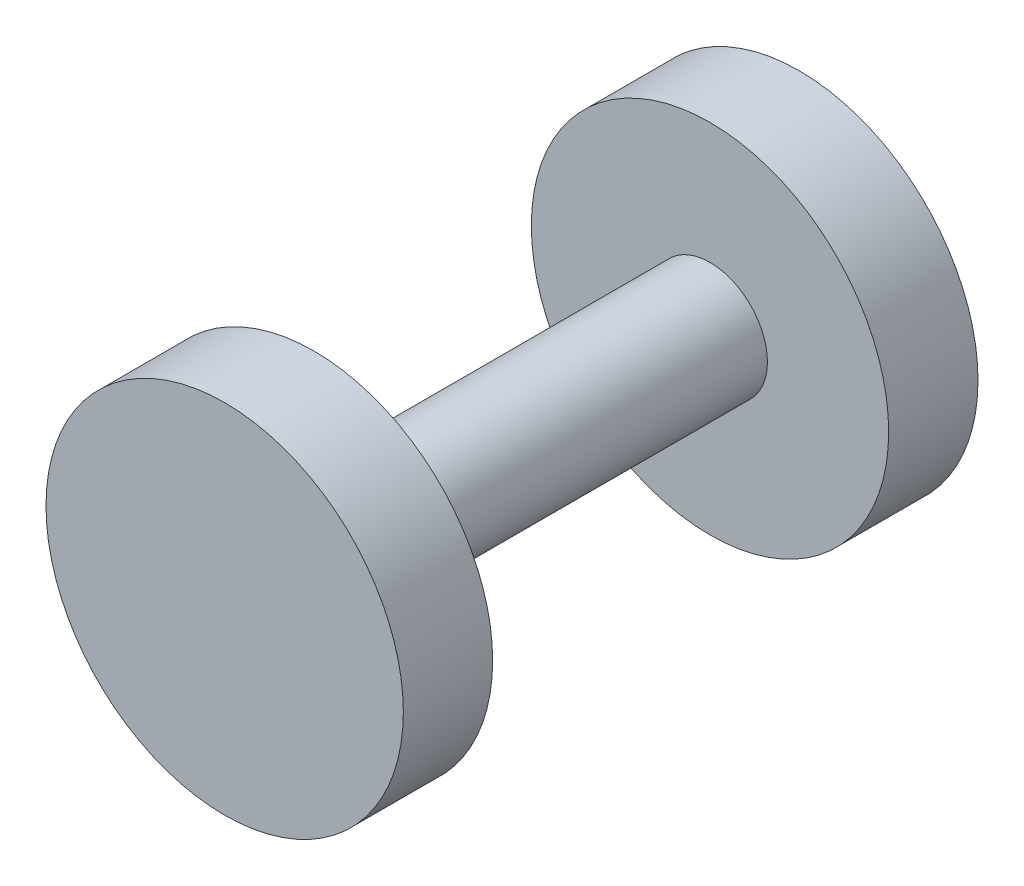
ISO-10303-21;
HEADER;
FILE_DESCRIPTION(('STEP AP214'),'2;1');
FILE_NAME('part.step','',(''),(''),'','','');
FILE_SCHEMA(('AUTOMOTIVE_DESIGN { 1 0 10303 214 1 1 1 1 }'));
ENDSEC;
DATA;
#1=APPLICATION_CONTEXT('core data for automotive mechanical design processes');
#2=APPLICATION_PROTOCOL_DEFINITION('international standard','automotive_design',2000,#1);
#3=PRODUCT_CONTEXT('',#1,'mechanical');
#4=PRODUCT('Part','Part','',(#3));
#5=PRODUCT_RELATED_PRODUCT_CATEGORY('part','',(#4));
#6=PRODUCT_DEFINITION_FORMATION('','',#4);
#7=PRODUCT_DEFINITION_CONTEXT('part definition',#1,'design');
#8=PRODUCT_DEFINITION('design','',#6,#7);
#9=PRODUCT_DEFINITION_SHAPE('','',#8);
#10=(LENGTH_UNIT() NAMED_UNIT(*) SI_UNIT(.MILLI.,.METRE.));
#11=(NAMED_UNIT(*) PLANE_ANGLE_UNIT() SI_UNIT($,.RADIAN.));
#12=(NAMED_UNIT(*) SI_UNIT($,.STERADIAN.) SOLID_ANGLE_UNIT());
#13=UNCERTAINTY_MEASURE_WITH_UNIT(LENGTH_MEASURE(1.E-05),#10,'distance_accuracy_value','');
#14=(GEOMETRIC_REPRESENTATION_CONTEXT(3) GLOBAL_UNCERTAINTY_ASSIGNED_CONTEXT((#13)) GLOBAL_UNIT_ASSIGNED_CONTEXT((#10,
#11,#12)) REPRESENTATION_CONTEXT('',''));
#15=CARTESIAN_POINT('',(0.,0.,0.));
#16=DIRECTION('',(0.,0.,1.));
#17=DIRECTION('',(1.,0.,0.));
#18=AXIS2_PLACEMENT_3D('',#15,#16,#17);
#19=CARTESIAN_POINT('',(0.,0.,24.8375451263538));
#20=DIRECTION('',(0.,0.,1.));
#21=DIRECTION('',(0.,-1.,0.));
#22=AXIS2_PLACEMENT_3D('',#19,#20,#21);
#23=PLANE('',#22);
#24=CARTESIAN_POINT('',(0.,0.,24.8375451263538));
#25=DIRECTION('',(0.,0.,-1.));
#26=DIRECTION('',(0.,1.,0.));
#27=AXIS2_PLACEMENT_3D('',#24,#25,#26);
#28=CIRCLE('',#27,10.);
#29=CARTESIAN_POINT('',(0.,10.,24.8375451263538));
#30=VERTEX_POINT('',#29);
#31=EDGE_CURVE('E10',#30,#30,#28,.T.);
#32=ORIENTED_EDGE('',*,*,#31,.F.);
#33=EDGE_LOOP('',(#32));
#34=FACE_BOUND('',#33,.T.);
#35=ADVANCED_FACE('F30',(#34),#23,.T.);
#36=CARTESIAN_POINT('',(0.,0.,-7.32851985559567));
#37=DIRECTION('',(0.,0.,-1.));
#38=DIRECTION('',(0.,1.,0.));
#39=AXIS2_PLACEMENT_3D('',#36,#37,#38);
#40=CYLINDRICAL_SURFACE('',#39,10.);
#41=ORIENTED_EDGE('',*,*,#31,.T.);
#42=EDGE_LOOP('',(#41));
#43=FACE_BOUND('',#42,.T.);
#44=CARTESIAN_POINT('',(0.,0.,19.8375451263538));
#45=DIRECTION('',(0.,0.,-1.));
#46=DIRECTION('',(0.,1.,0.));
#47=AXIS2_PLACEMENT_3D('',#44,#45,#46);
#48=CIRCLE('',#47,9.99999999999999);
#49=CARTESIAN_POINT('',(0.,9.99999999999999,19.8375451263538));
#50=VERTEX_POINT('',#49);
#51=EDGE_CURVE('E36',#50,#50,#48,.T.);
#52=ORIENTED_EDGE('',*,*,#51,.F.);
#53=EDGE_LOOP('',(#52));
#54=FACE_BOUND('',#53,.T.);
#55=ADVANCED_FACE('F72',(#43,#54),#40,.T.);
#56=CARTESIAN_POINT('',(0.,9.99999999999999,19.8375451263538));
#57=DIRECTION('',(0.,0.,-1.));
#58=DIRECTION('',(0.,1.,0.));
#59=AXIS2_PLACEMENT_3D('',#56,#57,#58);
#60=PLANE('',#59);
#61=ORIENTED_EDGE('',*,*,#51,.T.);
#62=EDGE_LOOP('',(#61));
#63=FACE_BOUND('',#62,.T.);
#64=CARTESIAN_POINT('',(0.,0.,19.8375451263538));
#65=DIRECTION('',(0.,0.,-1.));
#66=DIRECTION('',(0.,1.,0.));
#67=AXIS2_PLACEMENT_3D('',#64,#65,#66);
#68=CIRCLE('',#67,3.21299638989168);
#69=CARTESIAN_POINT('',(0.,3.21299638989168,19.8375451263538));
#70=VERTEX_POINT('',#69);
#71=EDGE_CURVE('E40',#70,#70,#68,.T.);
#72=ORIENTED_EDGE('',*,*,#71,.F.);
#73=EDGE_LOOP('',(#72));
#74=FACE_BOUND('',#73,.T.);
#75=ADVANCED_FACE('F77',(#63,#74),#60,.T.);
#76=CARTESIAN_POINT('',(0.,0.,-7.32851985559567));
#77=DIRECTION('',(0.,0.,-1.));
#78=DIRECTION('',(0.,1.,0.));
#79=AXIS2_PLACEMENT_3D('',#76,#77,#78);
#80=CYLINDRICAL_SURFACE('',#79,3.21299638989168);
#81=ORIENTED_EDGE('',*,*,#71,.T.);
#82=EDGE_LOOP('',(#81));
#83=FACE_BOUND('',#82,.T.);
#84=CARTESIAN_POINT('',(0.,0.,-2.32851985559567));
#85=DIRECTION('',(0.,0.,-1.));
#86=DIRECTION('',(0.,1.,0.));
#87=AXIS2_PLACEMENT_3D('',#84,#85,#86);
#88=CIRCLE('',#87,3.21299638989168);
#89=CARTESIAN_POINT('',(0.,3.21299638989168,-2.32851985559567));
#90=VERTEX_POINT('',#89);
#91=EDGE_CURVE('E44',#90,#90,#88,.T.);
#92=ORIENTED_EDGE('',*,*,#91,.F.);
#93=EDGE_LOOP('',(#92));
#94=FACE_BOUND('',#93,.T.);
#95=ADVANCED_FACE('F68',(#83,#94),#80,.T.);
#96=CARTESIAN_POINT('',(0.,3.21299638989168,-2.32851985559567));
#97=DIRECTION('',(0.,0.,1.));
#98=DIRECTION('',(0.,-1.,0.));
#99=AXIS2_PLACEMENT_3D('',#96,#97,#98);
#100=PLANE('',#99);
#101=ORIENTED_EDGE('',*,*,#91,.T.);
#102=EDGE_LOOP('',(#101));
#103=FACE_BOUND('',#102,.T.);
#104=CARTESIAN_POINT('',(0.,0.,-2.32851985559567));
#105=DIRECTION('',(0.,0.,-1.));
#106=DIRECTION('',(0.,1.,0.));
#107=AXIS2_PLACEMENT_3D('',#104,#105,#106);
#108=CIRCLE('',#107,9.99999999999999);
#109=CARTESIAN_POINT('',(0.,9.99999999999999,-2.32851985559567));
#110=VERTEX_POINT('',#109);
#111=EDGE_CURVE('E49',#110,#110,#108,.T.);
#112=ORIENTED_EDGE('',*,*,#111,.F.);
#113=EDGE_LOOP('',(#112));
#114=FACE_BOUND('',#113,.T.);
#115=ADVANCED_FACE('F60',(#103,#114),#100,.T.);
#116=CARTESIAN_POINT('',(0.,0.,-7.32851985559567));
#117=DIRECTION('',(0.,0.,-1.));
#118=DIRECTION('',(0.,1.,0.));
#119=AXIS2_PLACEMENT_3D('',#116,#117,#118);
#120=CYLINDRICAL_SURFACE('',#119,9.99999999999999);
#121=ORIENTED_EDGE('',*,*,#111,.T.);
#122=EDGE_LOOP('',(#121));
#123=FACE_BOUND('',#122,.T.);
#124=CARTESIAN_POINT('',(0.,0.,-7.32851985559567));
#125=DIRECTION('',(0.,0.,-1.));
#126=DIRECTION('',(0.,1.,0.));
#127=AXIS2_PLACEMENT_3D('',#124,#125,#126);
#128=CIRCLE('',#127,9.99999999999999);
#129=CARTESIAN_POINT('',(0.,9.99999999999999,-7.32851985559567));
#130=VERTEX_POINT('',#129);
#131=EDGE_CURVE('E52',#130,#130,#128,.T.);
#132=ORIENTED_EDGE('',*,*,#131,.F.);
#133=EDGE_LOOP('',(#132));
#134=FACE_BOUND('',#133,.T.);
#135=ADVANCED_FACE('F58',(#123,#134),#120,.T.);
#136=CARTESIAN_POINT('',(0.,9.99999999999999,-7.32851985559567));
#137=DIRECTION('',(0.,0.,-1.));
#138=DIRECTION('',(0.,1.,0.));
#139=AXIS2_PLACEMENT_3D('',#136,#137,#138);
#140=PLANE('',#139);
#141=ORIENTED_EDGE('',*,*,#131,.T.);
#142=EDGE_LOOP('',(#141));
#143=FACE_BOUND('',#142,.T.);
#144=ADVANCED_FACE('F56',(#143),#140,.T.);
#145=CLOSED_SHELL('',(#35,#55,#75,#95,#115,#135,#144));
#146=MANIFOLD_SOLID_BREP('B2',#145);
#147=ADVANCED_BREP_SHAPE_REPRESENTATION('',(#18,#146),#14);
#148=SHAPE_DEFINITION_REPRESENTATION(#9,#147);
ENDSEC;
END-ISO-10303-21;
